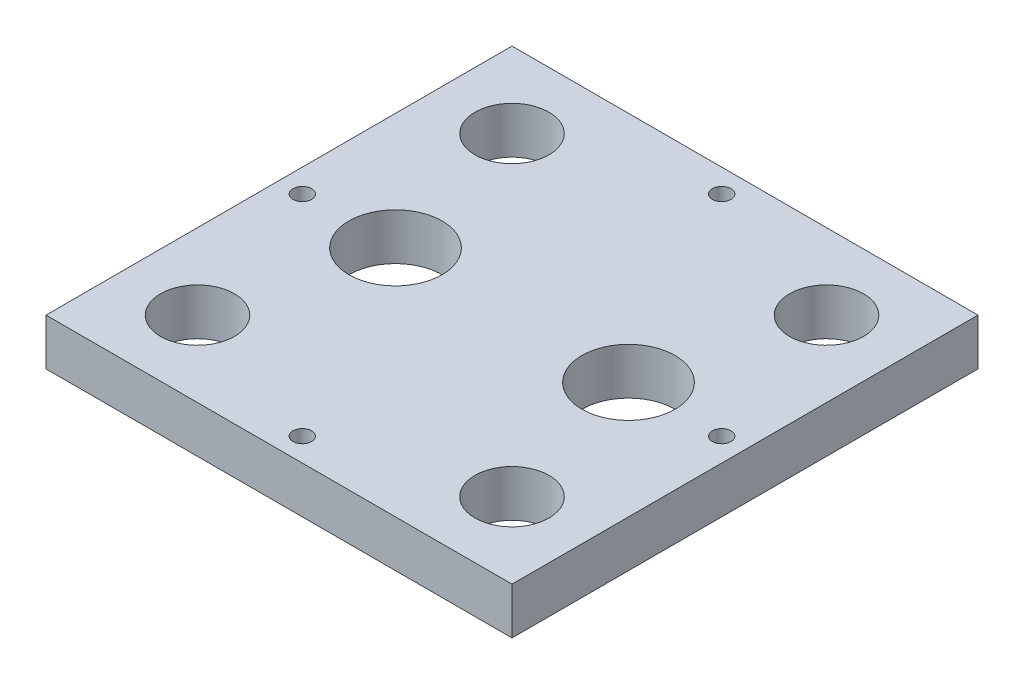
ISO-10303-21;
HEADER;
FILE_DESCRIPTION(('STEP AP214'),'2;1');
FILE_NAME('part.step','',(''),(''),'','','');
FILE_SCHEMA(('AUTOMOTIVE_DESIGN { 1 0 10303 214 1 1 1 1 }'));
ENDSEC;
DATA;
#1=APPLICATION_CONTEXT('core data for automotive mechanical design processes');
#2=APPLICATION_PROTOCOL_DEFINITION('international standard','automotive_design',2000,#1);
#3=PRODUCT_CONTEXT('',#1,'mechanical');
#4=PRODUCT('Part','Part','',(#3));
#5=PRODUCT_RELATED_PRODUCT_CATEGORY('part','',(#4));
#6=PRODUCT_DEFINITION_FORMATION('','',#4);
#7=PRODUCT_DEFINITION_CONTEXT('part definition',#1,'design');
#8=PRODUCT_DEFINITION('design','',#6,#7);
#9=PRODUCT_DEFINITION_SHAPE('','',#8);
#10=(LENGTH_UNIT() NAMED_UNIT(*) SI_UNIT(.MILLI.,.METRE.));
#11=(NAMED_UNIT(*) PLANE_ANGLE_UNIT() SI_UNIT($,.RADIAN.));
#12=(NAMED_UNIT(*) SI_UNIT($,.STERADIAN.) SOLID_ANGLE_UNIT());
#13=UNCERTAINTY_MEASURE_WITH_UNIT(LENGTH_MEASURE(1.E-05),#10,'distance_accuracy_value','');
#14=(GEOMETRIC_REPRESENTATION_CONTEXT(3) GLOBAL_UNCERTAINTY_ASSIGNED_CONTEXT((#13)) GLOBAL_UNIT_ASSIGNED_CONTEXT((#10,
#11,#12)) REPRESENTATION_CONTEXT('',''));
#15=CARTESIAN_POINT('',(0.,0.,0.));
#16=DIRECTION('',(0.,0.,1.));
#17=DIRECTION('',(1.,0.,0.));
#18=AXIS2_PLACEMENT_3D('',#15,#16,#17);
#19=CARTESIAN_POINT('',(0.,200.,0.));
#20=DIRECTION('',(0.,1.,0.));
#21=DIRECTION('',(0.,0.,1.));
#22=AXIS2_PLACEMENT_3D('',#19,#20,#21);
#23=PLANE('',#22);
#24=CARTESIAN_POINT('',(25.,200.,0.));
#25=DIRECTION('',(0.,1.,0.));
#26=DIRECTION('',(0.,0.,1.));
#27=AXIS2_PLACEMENT_3D('',#24,#25,#26);
#28=CIRCLE('',#27,9.99999999999999);
#29=CARTESIAN_POINT('',(25.,200.,9.99999999999999));
#30=VERTEX_POINT('',#29);
#31=EDGE_CURVE('E111',#30,#30,#28,.T.);
#32=ORIENTED_EDGE('',*,*,#31,.F.);
#33=EDGE_LOOP('',(#32));
#34=FACE_BOUND('',#33,.T.);
#35=CARTESIAN_POINT('',(-25.,200.,0.));
#36=DIRECTION('',(0.,1.,0.));
#37=DIRECTION('',(0.,0.,1.));
#38=AXIS2_PLACEMENT_3D('',#35,#36,#37);
#39=CIRCLE('',#38,10.);
#40=CARTESIAN_POINT('',(-25.,200.,10.));
#41=VERTEX_POINT('',#40);
#42=EDGE_CURVE('E117',#41,#41,#39,.T.);
#43=ORIENTED_EDGE('',*,*,#42,.F.);
#44=EDGE_LOOP('',(#43));
#45=FACE_BOUND('',#44,.T.);
#46=CARTESIAN_POINT('',(45.,200.,0.));
#47=DIRECTION('',(0.,1.,0.));
#48=DIRECTION('',(0.,0.,1.));
#49=AXIS2_PLACEMENT_3D('',#46,#47,#48);
#50=CIRCLE('',#49,2.);
#51=CARTESIAN_POINT('',(45.,200.,2.));
#52=VERTEX_POINT('',#51);
#53=EDGE_CURVE('E130',#52,#52,#50,.T.);
#54=ORIENTED_EDGE('',*,*,#53,.F.);
#55=EDGE_LOOP('',(#54));
#56=FACE_BOUND('',#55,.T.);
#57=CARTESIAN_POINT('',(0.,200.,45.));
#58=DIRECTION('',(0.,1.,0.));
#59=DIRECTION('',(0.,0.,1.));
#60=AXIS2_PLACEMENT_3D('',#57,#58,#59);
#61=CIRCLE('',#60,2.);
#62=CARTESIAN_POINT('',(0.,200.,47.));
#63=VERTEX_POINT('',#62);
#64=EDGE_CURVE('E142',#63,#63,#61,.T.);
#65=ORIENTED_EDGE('',*,*,#64,.F.);
#66=EDGE_LOOP('',(#65));
#67=FACE_BOUND('',#66,.T.);
#68=CARTESIAN_POINT('',(-33.7459,200.,-33.7459));
#69=DIRECTION('',(0.,1.,0.));
#70=DIRECTION('',(0.,0.,1.));
#71=AXIS2_PLACEMENT_3D('',#68,#69,#70);
#72=CIRCLE('',#71,7.9375);
#73=CARTESIAN_POINT('',(-33.7459,200.,-25.8084));
#74=VERTEX_POINT('',#73);
#75=EDGE_CURVE('E154',#74,#74,#72,.T.);
#76=ORIENTED_EDGE('',*,*,#75,.F.);
#77=EDGE_LOOP('',(#76));
#78=FACE_BOUND('',#77,.T.);
#79=CARTESIAN_POINT('',(-33.7459,200.,33.7459));
#80=DIRECTION('',(0.,1.,0.));
#81=DIRECTION('',(0.,0.,1.));
#82=AXIS2_PLACEMENT_3D('',#79,#80,#81);
#83=CIRCLE('',#82,7.9375);
#84=CARTESIAN_POINT('',(-33.7459,200.,41.6834));
#85=VERTEX_POINT('',#84);
#86=EDGE_CURVE('E104',#85,#85,#83,.T.);
#87=ORIENTED_EDGE('',*,*,#86,.F.);
#88=EDGE_LOOP('',(#87));
#89=FACE_BOUND('',#88,.T.);
#90=DIRECTION('',(-1.,0.,0.));
#91=VECTOR('',#90,1.);
#92=CARTESIAN_POINT('',(0.,200.,-50.));
#93=LINE('',#92,#91);
#94=CARTESIAN_POINT('',(50.,200.,-50.));
#95=VERTEX_POINT('',#94);
#96=CARTESIAN_POINT('',(-50.,200.,-50.));
#97=VERTEX_POINT('',#96);
#98=EDGE_CURVE('E88',#95,#97,#93,.T.);
#99=ORIENTED_EDGE('',*,*,#98,.T.);
#100=DIRECTION('',(0.,0.,1.));
#101=VECTOR('',#100,1.);
#102=CARTESIAN_POINT('',(-50.,200.,0.));
#103=LINE('',#102,#101);
#104=CARTESIAN_POINT('',(-50.,200.,50.));
#105=VERTEX_POINT('',#104);
#106=EDGE_CURVE('E83',#97,#105,#103,.T.);
#107=ORIENTED_EDGE('',*,*,#106,.T.);
#108=DIRECTION('',(1.,0.,0.));
#109=VECTOR('',#108,1.);
#110=CARTESIAN_POINT('',(0.,200.,50.));
#111=LINE('',#110,#109);
#112=CARTESIAN_POINT('',(50.,200.,50.));
#113=VERTEX_POINT('',#112);
#114=EDGE_CURVE('E86',#105,#113,#111,.T.);
#115=ORIENTED_EDGE('',*,*,#114,.T.);
#116=DIRECTION('',(0.,0.,-1.));
#117=VECTOR('',#116,1.);
#118=CARTESIAN_POINT('',(50.,200.,0.));
#119=LINE('',#118,#117);
#120=EDGE_CURVE('E53',#113,#95,#119,.T.);
#121=ORIENTED_EDGE('',*,*,#120,.T.);
#122=EDGE_LOOP('',(#99,#107,#115,#121));
#123=FACE_BOUND('',#122,.T.);
#124=CARTESIAN_POINT('',(33.7459,200.,-33.7459));
#125=DIRECTION('',(0.,1.,0.));
#126=DIRECTION('',(0.,0.,1.));
#127=AXIS2_PLACEMENT_3D('',#124,#125,#126);
#128=CIRCLE('',#127,7.93750000000001);
#129=CARTESIAN_POINT('',(33.7459,200.,-25.8084));
#130=VERTEX_POINT('',#129);
#131=EDGE_CURVE('E160',#130,#130,#128,.T.);
#132=ORIENTED_EDGE('',*,*,#131,.F.);
#133=EDGE_LOOP('',(#132));
#134=FACE_BOUND('',#133,.T.);
#135=CARTESIAN_POINT('',(33.7459,200.,33.7459));
#136=DIRECTION('',(0.,1.,0.));
#137=DIRECTION('',(0.,0.,1.));
#138=AXIS2_PLACEMENT_3D('',#135,#136,#137);
#139=CIRCLE('',#138,7.93750000000001);
#140=CARTESIAN_POINT('',(33.7459,200.,41.6834));
#141=VERTEX_POINT('',#140);
#142=EDGE_CURVE('E148',#141,#141,#139,.T.);
#143=ORIENTED_EDGE('',*,*,#142,.F.);
#144=EDGE_LOOP('',(#143));
#145=FACE_BOUND('',#144,.T.);
#146=CARTESIAN_POINT('',(-45.,200.,0.));
#147=DIRECTION('',(0.,1.,0.));
#148=DIRECTION('',(0.,0.,1.));
#149=AXIS2_PLACEMENT_3D('',#146,#147,#148);
#150=CIRCLE('',#149,2.);
#151=CARTESIAN_POINT('',(-45.,200.,2.00000000000001));
#152=VERTEX_POINT('',#151);
#153=EDGE_CURVE('E136',#152,#152,#150,.T.);
#154=ORIENTED_EDGE('',*,*,#153,.F.);
#155=EDGE_LOOP('',(#154));
#156=FACE_BOUND('',#155,.T.);
#157=CARTESIAN_POINT('',(0.,200.,-45.));
#158=DIRECTION('',(0.,1.,0.));
#159=DIRECTION('',(0.,0.,1.));
#160=AXIS2_PLACEMENT_3D('',#157,#158,#159);
#161=CIRCLE('',#160,2.);
#162=CARTESIAN_POINT('',(0.,200.,-43.));
#163=VERTEX_POINT('',#162);
#164=EDGE_CURVE('E124',#163,#163,#161,.T.);
#165=ORIENTED_EDGE('',*,*,#164,.F.);
#166=EDGE_LOOP('',(#165));
#167=FACE_BOUND('',#166,.T.);
#168=ADVANCED_FACE('F34',(#34,#45,#56,#67,#78,#89,#123,#134,#145,#156,#167),#23,.T.);
#169=CARTESIAN_POINT('',(0.,190.,0.));
#170=DIRECTION('',(0.,1.,0.));
#171=DIRECTION('',(0.,0.,1.));
#172=AXIS2_PLACEMENT_3D('',#169,#170,#171);
#173=PLANE('',#172);
#174=CARTESIAN_POINT('',(25.,190.,0.));
#175=DIRECTION('',(0.,1.,0.));
#176=DIRECTION('',(0.,0.,1.));
#177=AXIS2_PLACEMENT_3D('',#174,#175,#176);
#178=CIRCLE('',#177,9.99999999999999);
#179=CARTESIAN_POINT('',(25.,190.,9.99999999999999));
#180=VERTEX_POINT('',#179);
#181=EDGE_CURVE('E38',#180,#180,#178,.T.);
#182=ORIENTED_EDGE('',*,*,#181,.T.);
#183=EDGE_LOOP('',(#182));
#184=FACE_BOUND('',#183,.T.);
#185=CARTESIAN_POINT('',(-25.,190.,0.));
#186=DIRECTION('',(0.,1.,0.));
#187=DIRECTION('',(0.,0.,1.));
#188=AXIS2_PLACEMENT_3D('',#185,#186,#187);
#189=CIRCLE('',#188,10.);
#190=CARTESIAN_POINT('',(-25.,190.,10.));
#191=VERTEX_POINT('',#190);
#192=EDGE_CURVE('E109',#191,#191,#189,.T.);
#193=ORIENTED_EDGE('',*,*,#192,.T.);
#194=EDGE_LOOP('',(#193));
#195=FACE_BOUND('',#194,.T.);
#196=DIRECTION('',(-1.,0.,0.));
#197=VECTOR('',#196,1.);
#198=CARTESIAN_POINT('',(0.,190.,-50.));
#199=LINE('',#198,#197);
#200=CARTESIAN_POINT('',(50.,190.,-50.));
#201=VERTEX_POINT('',#200);
#202=CARTESIAN_POINT('',(-50.,190.,-50.));
#203=VERTEX_POINT('',#202);
#204=EDGE_CURVE('E101',#201,#203,#199,.T.);
#205=ORIENTED_EDGE('',*,*,#204,.F.);
#206=DIRECTION('',(0.,0.,-1.));
#207=VECTOR('',#206,1.);
#208=CARTESIAN_POINT('',(50.,190.,0.));
#209=LINE('',#208,#207);
#210=CARTESIAN_POINT('',(50.,190.,50.));
#211=VERTEX_POINT('',#210);
#212=EDGE_CURVE('E76',#211,#201,#209,.T.);
#213=ORIENTED_EDGE('',*,*,#212,.F.);
#214=DIRECTION('',(1.,0.,0.));
#215=VECTOR('',#214,1.);
#216=CARTESIAN_POINT('',(0.,190.,50.));
#217=LINE('',#216,#215);
#218=CARTESIAN_POINT('',(-50.,190.,50.));
#219=VERTEX_POINT('',#218);
#220=EDGE_CURVE('E70',#219,#211,#217,.T.);
#221=ORIENTED_EDGE('',*,*,#220,.F.);
#222=DIRECTION('',(0.,0.,1.));
#223=VECTOR('',#222,1.);
#224=CARTESIAN_POINT('',(-50.,190.,0.));
#225=LINE('',#224,#223);
#226=EDGE_CURVE('E92',#203,#219,#225,.T.);
#227=ORIENTED_EDGE('',*,*,#226,.F.);
#228=EDGE_LOOP('',(#205,#213,#221,#227));
#229=FACE_BOUND('',#228,.T.);
#230=CARTESIAN_POINT('',(-33.7459,190.,33.7459));
#231=DIRECTION('',(0.,1.,0.));
#232=DIRECTION('',(0.,0.,1.));
#233=AXIS2_PLACEMENT_3D('',#230,#231,#232);
#234=CIRCLE('',#233,7.9375);
#235=CARTESIAN_POINT('',(-33.7459,190.,41.6834));
#236=VERTEX_POINT('',#235);
#237=EDGE_CURVE('E163',#236,#236,#234,.T.);
#238=ORIENTED_EDGE('',*,*,#237,.T.);
#239=EDGE_LOOP('',(#238));
#240=FACE_BOUND('',#239,.T.);
#241=CARTESIAN_POINT('',(33.7459,190.,-33.7459));
#242=DIRECTION('',(0.,1.,0.));
#243=DIRECTION('',(0.,0.,1.));
#244=AXIS2_PLACEMENT_3D('',#241,#242,#243);
#245=CIRCLE('',#244,7.93750000000001);
#246=CARTESIAN_POINT('',(33.7459,190.,-25.8084));
#247=VERTEX_POINT('',#246);
#248=EDGE_CURVE('E157',#247,#247,#245,.T.);
#249=ORIENTED_EDGE('',*,*,#248,.T.);
#250=EDGE_LOOP('',(#249));
#251=FACE_BOUND('',#250,.T.);
#252=CARTESIAN_POINT('',(-33.7459,190.,-33.7459));
#253=DIRECTION('',(0.,1.,0.));
#254=DIRECTION('',(0.,0.,1.));
#255=AXIS2_PLACEMENT_3D('',#252,#253,#254);
#256=CIRCLE('',#255,7.9375);
#257=CARTESIAN_POINT('',(-33.7459,190.,-25.8084));
#258=VERTEX_POINT('',#257);
#259=EDGE_CURVE('E151',#258,#258,#256,.T.);
#260=ORIENTED_EDGE('',*,*,#259,.T.);
#261=EDGE_LOOP('',(#260));
#262=FACE_BOUND('',#261,.T.);
#263=CARTESIAN_POINT('',(33.7459,190.,33.7459));
#264=DIRECTION('',(0.,1.,0.));
#265=DIRECTION('',(0.,0.,1.));
#266=AXIS2_PLACEMENT_3D('',#263,#264,#265);
#267=CIRCLE('',#266,7.93750000000001);
#268=CARTESIAN_POINT('',(33.7459,190.,41.6834));
#269=VERTEX_POINT('',#268);
#270=EDGE_CURVE('E145',#269,#269,#267,.T.);
#271=ORIENTED_EDGE('',*,*,#270,.T.);
#272=EDGE_LOOP('',(#271));
#273=FACE_BOUND('',#272,.T.);
#274=CARTESIAN_POINT('',(0.,190.,45.));
#275=DIRECTION('',(0.,1.,0.));
#276=DIRECTION('',(0.,0.,1.));
#277=AXIS2_PLACEMENT_3D('',#274,#275,#276);
#278=CIRCLE('',#277,2.);
#279=CARTESIAN_POINT('',(0.,190.,47.));
#280=VERTEX_POINT('',#279);
#281=EDGE_CURVE('E139',#280,#280,#278,.T.);
#282=ORIENTED_EDGE('',*,*,#281,.T.);
#283=EDGE_LOOP('',(#282));
#284=FACE_BOUND('',#283,.T.);
#285=CARTESIAN_POINT('',(-45.,190.,0.));
#286=DIRECTION('',(0.,1.,0.));
#287=DIRECTION('',(0.,0.,1.));
#288=AXIS2_PLACEMENT_3D('',#285,#286,#287);
#289=CIRCLE('',#288,2.);
#290=CARTESIAN_POINT('',(-45.,190.,2.00000000000001));
#291=VERTEX_POINT('',#290);
#292=EDGE_CURVE('E133',#291,#291,#289,.T.);
#293=ORIENTED_EDGE('',*,*,#292,.T.);
#294=EDGE_LOOP('',(#293));
#295=FACE_BOUND('',#294,.T.);
#296=CARTESIAN_POINT('',(45.,190.,0.));
#297=DIRECTION('',(0.,1.,0.));
#298=DIRECTION('',(0.,0.,1.));
#299=AXIS2_PLACEMENT_3D('',#296,#297,#298);
#300=CIRCLE('',#299,2.);
#301=CARTESIAN_POINT('',(45.,190.,2.));
#302=VERTEX_POINT('',#301);
#303=EDGE_CURVE('E127',#302,#302,#300,.T.);
#304=ORIENTED_EDGE('',*,*,#303,.T.);
#305=EDGE_LOOP('',(#304));
#306=FACE_BOUND('',#305,.T.);
#307=CARTESIAN_POINT('',(0.,190.,-45.));
#308=DIRECTION('',(0.,1.,0.));
#309=DIRECTION('',(0.,0.,1.));
#310=AXIS2_PLACEMENT_3D('',#307,#308,#309);
#311=CIRCLE('',#310,2.);
#312=CARTESIAN_POINT('',(0.,190.,-43.));
#313=VERTEX_POINT('',#312);
#314=EDGE_CURVE('E115',#313,#313,#311,.T.);
#315=ORIENTED_EDGE('',*,*,#314,.T.);
#316=EDGE_LOOP('',(#315));
#317=FACE_BOUND('',#316,.T.);
#318=ADVANCED_FACE('F171',(#184,#195,#229,#240,#251,#262,#273,#284,#295,#306,#317),#173,.F.);
#319=CARTESIAN_POINT('',(0.,200.,-50.));
#320=DIRECTION('',(0.,0.,1.));
#321=DIRECTION('',(1.,0.,0.));
#322=AXIS2_PLACEMENT_3D('',#319,#320,#321);
#323=PLANE('',#322);
#324=ORIENTED_EDGE('',*,*,#204,.T.);
#325=DIRECTION('',(0.,-1.,0.));
#326=VECTOR('',#325,1.);
#327=CARTESIAN_POINT('',(-50.,200.,-50.));
#328=LINE('',#327,#326);
#329=EDGE_CURVE('E11',#97,#203,#328,.T.);
#330=ORIENTED_EDGE('',*,*,#329,.F.);
#331=ORIENTED_EDGE('',*,*,#98,.F.);
#332=DIRECTION('',(0.,-1.,0.));
#333=VECTOR('',#332,1.);
#334=CARTESIAN_POINT('',(50.,200.,-50.));
#335=LINE('',#334,#333);
#336=EDGE_CURVE('E97',#95,#201,#335,.T.);
#337=ORIENTED_EDGE('',*,*,#336,.T.);
#338=EDGE_LOOP('',(#324,#330,#331,#337));
#339=FACE_BOUND('',#338,.T.);
#340=ADVANCED_FACE('F36',(#339),#323,.F.);
#341=CARTESIAN_POINT('',(-50.,200.,0.));
#342=DIRECTION('',(1.,0.,0.));
#343=DIRECTION('',(0.,0.,-1.));
#344=AXIS2_PLACEMENT_3D('',#341,#342,#343);
#345=PLANE('',#344);
#346=ORIENTED_EDGE('',*,*,#226,.T.);
#347=DIRECTION('',(0.,-1.,0.));
#348=VECTOR('',#347,1.);
#349=CARTESIAN_POINT('',(-50.,200.,50.));
#350=LINE('',#349,#348);
#351=EDGE_CURVE('E44',#105,#219,#350,.T.);
#352=ORIENTED_EDGE('',*,*,#351,.F.);
#353=ORIENTED_EDGE('',*,*,#106,.F.);
#354=ORIENTED_EDGE('',*,*,#329,.T.);
#355=EDGE_LOOP('',(#346,#352,#353,#354));
#356=FACE_BOUND('',#355,.T.);
#357=ADVANCED_FACE('F91',(#356),#345,.F.);
#358=CARTESIAN_POINT('',(0.,200.,50.));
#359=DIRECTION('',(0.,0.,-1.));
#360=DIRECTION('',(-1.,0.,0.));
#361=AXIS2_PLACEMENT_3D('',#358,#359,#360);
#362=PLANE('',#361);
#363=ORIENTED_EDGE('',*,*,#220,.T.);
#364=DIRECTION('',(0.,-1.,0.));
#365=VECTOR('',#364,1.);
#366=CARTESIAN_POINT('',(50.,200.,50.));
#367=LINE('',#366,#365);
#368=EDGE_CURVE('E93',#113,#211,#367,.T.);
#369=ORIENTED_EDGE('',*,*,#368,.F.);
#370=ORIENTED_EDGE('',*,*,#114,.F.);
#371=ORIENTED_EDGE('',*,*,#351,.T.);
#372=EDGE_LOOP('',(#363,#369,#370,#371));
#373=FACE_BOUND('',#372,.T.);
#374=ADVANCED_FACE('F95',(#373),#362,.F.);
#375=CARTESIAN_POINT('',(50.,200.,0.));
#376=DIRECTION('',(-1.,0.,0.));
#377=DIRECTION('',(0.,0.,1.));
#378=AXIS2_PLACEMENT_3D('',#375,#376,#377);
#379=PLANE('',#378);
#380=ORIENTED_EDGE('',*,*,#212,.T.);
#381=ORIENTED_EDGE('',*,*,#336,.F.);
#382=ORIENTED_EDGE('',*,*,#120,.F.);
#383=ORIENTED_EDGE('',*,*,#368,.T.);
#384=EDGE_LOOP('',(#380,#381,#382,#383));
#385=FACE_BOUND('',#384,.T.);
#386=ADVANCED_FACE('F177',(#385),#379,.F.);
#387=CARTESIAN_POINT('',(-33.7459,200.,33.7459));
#388=DIRECTION('',(0.,-1.,0.));
#389=DIRECTION('',(0.,0.,-1.));
#390=AXIS2_PLACEMENT_3D('',#387,#388,#389);
#391=CYLINDRICAL_SURFACE('',#390,7.9375);
#392=ORIENTED_EDGE('',*,*,#86,.T.);
#393=EDGE_LOOP('',(#392));
#394=FACE_BOUND('',#393,.T.);
#395=ORIENTED_EDGE('',*,*,#237,.F.);
#396=EDGE_LOOP('',(#395));
#397=FACE_BOUND('',#396,.T.);
#398=ADVANCED_FACE('F174',(#394,#397),#391,.F.);
#399=CARTESIAN_POINT('',(33.7459,200.,-33.7459));
#400=DIRECTION('',(0.,-1.,0.));
#401=DIRECTION('',(0.,0.,-1.));
#402=AXIS2_PLACEMENT_3D('',#399,#400,#401);
#403=CYLINDRICAL_SURFACE('',#402,7.93750000000001);
#404=ORIENTED_EDGE('',*,*,#131,.T.);
#405=EDGE_LOOP('',(#404));
#406=FACE_BOUND('',#405,.T.);
#407=ORIENTED_EDGE('',*,*,#248,.F.);
#408=EDGE_LOOP('',(#407));
#409=FACE_BOUND('',#408,.T.);
#410=ADVANCED_FACE('F176',(#406,#409),#403,.F.);
#411=CARTESIAN_POINT('',(-33.7459,200.,-33.7459));
#412=DIRECTION('',(0.,-1.,0.));
#413=DIRECTION('',(0.,0.,-1.));
#414=AXIS2_PLACEMENT_3D('',#411,#412,#413);
#415=CYLINDRICAL_SURFACE('',#414,7.9375);
#416=ORIENTED_EDGE('',*,*,#75,.T.);
#417=EDGE_LOOP('',(#416));
#418=FACE_BOUND('',#417,.T.);
#419=ORIENTED_EDGE('',*,*,#259,.F.);
#420=EDGE_LOOP('',(#419));
#421=FACE_BOUND('',#420,.T.);
#422=ADVANCED_FACE('F184',(#418,#421),#415,.F.);
#423=CARTESIAN_POINT('',(33.7459,200.,33.7459));
#424=DIRECTION('',(0.,-1.,0.));
#425=DIRECTION('',(0.,0.,-1.));
#426=AXIS2_PLACEMENT_3D('',#423,#424,#425);
#427=CYLINDRICAL_SURFACE('',#426,7.93750000000001);
#428=ORIENTED_EDGE('',*,*,#142,.T.);
#429=EDGE_LOOP('',(#428));
#430=FACE_BOUND('',#429,.T.);
#431=ORIENTED_EDGE('',*,*,#270,.F.);
#432=EDGE_LOOP('',(#431));
#433=FACE_BOUND('',#432,.T.);
#434=ADVANCED_FACE('F237',(#430,#433),#427,.F.);
#435=CARTESIAN_POINT('',(0.,200.,45.));
#436=DIRECTION('',(0.,-1.,0.));
#437=DIRECTION('',(0.,0.,-1.));
#438=AXIS2_PLACEMENT_3D('',#435,#436,#437);
#439=CYLINDRICAL_SURFACE('',#438,2.);
#440=ORIENTED_EDGE('',*,*,#64,.T.);
#441=EDGE_LOOP('',(#440));
#442=FACE_BOUND('',#441,.T.);
#443=ORIENTED_EDGE('',*,*,#281,.F.);
#444=EDGE_LOOP('',(#443));
#445=FACE_BOUND('',#444,.T.);
#446=ADVANCED_FACE('F246',(#442,#445),#439,.F.);
#447=CARTESIAN_POINT('',(-45.,200.,0.));
#448=DIRECTION('',(0.,-1.,0.));
#449=DIRECTION('',(0.,0.,-1.));
#450=AXIS2_PLACEMENT_3D('',#447,#448,#449);
#451=CYLINDRICAL_SURFACE('',#450,2.);
#452=ORIENTED_EDGE('',*,*,#153,.T.);
#453=EDGE_LOOP('',(#452));
#454=FACE_BOUND('',#453,.T.);
#455=ORIENTED_EDGE('',*,*,#292,.F.);
#456=EDGE_LOOP('',(#455));
#457=FACE_BOUND('',#456,.T.);
#458=ADVANCED_FACE('F255',(#454,#457),#451,.F.);
#459=CARTESIAN_POINT('',(45.,200.,0.));
#460=DIRECTION('',(0.,-1.,0.));
#461=DIRECTION('',(0.,0.,-1.));
#462=AXIS2_PLACEMENT_3D('',#459,#460,#461);
#463=CYLINDRICAL_SURFACE('',#462,2.);
#464=ORIENTED_EDGE('',*,*,#53,.T.);
#465=EDGE_LOOP('',(#464));
#466=FACE_BOUND('',#465,.T.);
#467=ORIENTED_EDGE('',*,*,#303,.F.);
#468=EDGE_LOOP('',(#467));
#469=FACE_BOUND('',#468,.T.);
#470=ADVANCED_FACE('F264',(#466,#469),#463,.F.);
#471=CARTESIAN_POINT('',(0.,200.,-45.));
#472=DIRECTION('',(0.,-1.,0.));
#473=DIRECTION('',(0.,0.,-1.));
#474=AXIS2_PLACEMENT_3D('',#471,#472,#473);
#475=CYLINDRICAL_SURFACE('',#474,2.);
#476=ORIENTED_EDGE('',*,*,#164,.T.);
#477=EDGE_LOOP('',(#476));
#478=FACE_BOUND('',#477,.T.);
#479=ORIENTED_EDGE('',*,*,#314,.F.);
#480=EDGE_LOOP('',(#479));
#481=FACE_BOUND('',#480,.T.);
#482=ADVANCED_FACE('F273',(#478,#481),#475,.F.);
#483=CARTESIAN_POINT('',(-25.,-1.2E-05,0.));
#484=DIRECTION('',(0.,1.,0.));
#485=DIRECTION('',(0.,0.,1.));
#486=AXIS2_PLACEMENT_3D('',#483,#484,#485);
#487=CYLINDRICAL_SURFACE('',#486,10.);
#488=CARTESIAN_POINT('',(-25.,200.,10.));
#489=CARTESIAN_POINT('',(-25.,199.895833333333,10.));
#490=CARTESIAN_POINT('',(-25.,199.791666666667,10.));
#491=CARTESIAN_POINT('',(-25.,199.583333333333,10.));
#492=CARTESIAN_POINT('',(-25.,199.479166666667,10.));
#493=CARTESIAN_POINT('',(-25.,199.270833333333,10.));
#494=CARTESIAN_POINT('',(-25.,199.166666666667,10.));
#495=CARTESIAN_POINT('',(-25.,198.958333333333,10.));
#496=CARTESIAN_POINT('',(-25.,198.854166666667,10.));
#497=CARTESIAN_POINT('',(-25.,198.645833333333,10.));
#498=CARTESIAN_POINT('',(-25.,198.541666666667,10.));
#499=CARTESIAN_POINT('',(-25.,198.333333333333,10.));
#500=CARTESIAN_POINT('',(-25.,198.229166666667,10.));
#501=CARTESIAN_POINT('',(-25.,198.020833333333,10.));
#502=CARTESIAN_POINT('',(-25.,197.916666666667,10.));
#503=CARTESIAN_POINT('',(-25.,197.708333333333,10.));
#504=CARTESIAN_POINT('',(-25.,197.604166666667,10.));
#505=CARTESIAN_POINT('',(-25.,197.395833333333,10.));
#506=CARTESIAN_POINT('',(-25.,197.291666666667,10.));
#507=CARTESIAN_POINT('',(-25.,197.083333333333,10.));
#508=CARTESIAN_POINT('',(-25.,196.979166666667,10.));
#509=CARTESIAN_POINT('',(-25.,196.770833333333,10.));
#510=CARTESIAN_POINT('',(-25.,196.666666666667,10.));
#511=CARTESIAN_POINT('',(-25.,196.458333333333,10.));
#512=CARTESIAN_POINT('',(-25.,196.354166666667,10.));
#513=CARTESIAN_POINT('',(-25.,196.145833333333,10.));
#514=CARTESIAN_POINT('',(-25.,196.041666666667,10.));
#515=CARTESIAN_POINT('',(-25.,195.833333333333,10.));
#516=CARTESIAN_POINT('',(-25.,195.729166666667,10.));
#517=CARTESIAN_POINT('',(-25.,195.520833333333,10.));
#518=CARTESIAN_POINT('',(-25.,195.416666666667,10.));
#519=CARTESIAN_POINT('',(-25.,195.208333333333,10.));
#520=CARTESIAN_POINT('',(-25.,195.104166666667,10.));
#521=CARTESIAN_POINT('',(-25.,194.895833333333,10.));
#522=CARTESIAN_POINT('',(-25.,194.791666666667,10.));
#523=CARTESIAN_POINT('',(-25.,194.583333333333,10.));
#524=CARTESIAN_POINT('',(-25.,194.479166666667,10.));
#525=CARTESIAN_POINT('',(-25.,194.270833333333,10.));
#526=CARTESIAN_POINT('',(-25.,194.166666666667,10.));
#527=CARTESIAN_POINT('',(-25.,193.958333333333,10.));
#528=CARTESIAN_POINT('',(-25.,193.854166666667,10.));
#529=CARTESIAN_POINT('',(-25.,193.645833333333,10.));
#530=CARTESIAN_POINT('',(-25.,193.541666666667,10.));
#531=CARTESIAN_POINT('',(-25.,193.333333333333,10.));
#532=CARTESIAN_POINT('',(-25.,193.229166666667,10.));
#533=CARTESIAN_POINT('',(-25.,193.020833333333,10.));
#534=CARTESIAN_POINT('',(-25.,192.916666666667,10.));
#535=CARTESIAN_POINT('',(-25.,192.708333333333,10.));
#536=CARTESIAN_POINT('',(-25.,192.604166666667,10.));
#537=CARTESIAN_POINT('',(-25.,192.395833333333,10.));
#538=CARTESIAN_POINT('',(-25.,192.291666666667,10.));
#539=CARTESIAN_POINT('',(-25.,192.083333333333,10.));
#540=CARTESIAN_POINT('',(-25.,191.979166666667,10.));
#541=CARTESIAN_POINT('',(-25.,191.770833333333,10.));
#542=CARTESIAN_POINT('',(-25.,191.666666666667,10.));
#543=CARTESIAN_POINT('',(-25.,191.458333333333,10.));
#544=CARTESIAN_POINT('',(-25.,191.354166666667,10.));
#545=CARTESIAN_POINT('',(-25.,191.145833333333,10.));
#546=CARTESIAN_POINT('',(-25.,191.041666666667,10.));
#547=CARTESIAN_POINT('',(-25.,190.833333333333,10.));
#548=CARTESIAN_POINT('',(-25.,190.729166666667,10.));
#549=CARTESIAN_POINT('',(-25.,190.520833333333,10.));
#550=CARTESIAN_POINT('',(-25.,190.416666666667,10.));
#551=CARTESIAN_POINT('',(-25.,190.208333333333,10.));
#552=CARTESIAN_POINT('',(-25.,190.104166666667,10.));
#553=CARTESIAN_POINT('',(-25.,190.,10.));
#554=B_SPLINE_CURVE_WITH_KNOTS('',3,(#488,#489,#490,#491,#492,#493,#494,#495,#496,#497,#498,
#499,#500,#501,#502,#503,#504,#505,#506,#507,#508,#509,#510,#511,#512,#513,#514,#515,#516,#517,
#518,#519,#520,#521,#522,#523,#524,#525,#526,#527,#528,#529,#530,#531,#532,#533,#534,#535,#536,
#537,#538,#539,#540,#541,#542,#543,#544,#545,#546,#547,#548,#549,#550,#551,#552,#553),
.UNSPECIFIED.,.F.,.F.,(4,2,2,2,2,2,2,2,2,2,2,2,2,2,2,2,2,2,2,2,2,2,2,2,2,2,2,2,2,2,2,2,4),(0.,
0.312499999999993,0.624999999999987,0.937500000000008,1.25,1.56249999999999,1.87500000000002,
2.18750000000001,2.5,2.8125,3.12499999999999,3.43750000000001,3.75,4.0625,4.37500000000002,
4.68750000000001,5.,5.3125,5.62499999999999,5.93750000000001,6.25000000000001,6.5625,
6.87500000000002,7.18750000000001,7.50000000000001,7.8125,8.12499999999999,8.43750000000001,
8.75000000000001,9.0625,9.37500000000002,9.68750000000002,10.),.UNSPECIFIED.);
#555=EDGE_CURVE('BSEAM282',#41,#191,#554,.T.);
#556=ORIENTED_EDGE('',*,*,#42,.T.);
#557=ORIENTED_EDGE('',*,*,#192,.F.);
#558=ORIENTED_EDGE('',*,*,#555,.T.);
#559=ORIENTED_EDGE('',*,*,#555,.F.);
#560=EDGE_LOOP('',(#556,#558,#557,#559));
#561=FACE_BOUND('',#560,.T.);
#562=ADVANCED_FACE('F282',(#561),#487,.F.);
#563=CARTESIAN_POINT('',(25.,-1.2E-05,0.));
#564=DIRECTION('',(0.,1.,0.));
#565=DIRECTION('',(0.,0.,1.));
#566=AXIS2_PLACEMENT_3D('',#563,#564,#565);
#567=CYLINDRICAL_SURFACE('',#566,9.99999999999999);
#568=CARTESIAN_POINT('',(25.,200.,9.99999999999999));
#569=CARTESIAN_POINT('',(25.,199.895833333333,9.99999999999999));
#570=CARTESIAN_POINT('',(25.,199.791666666667,9.99999999999999));
#571=CARTESIAN_POINT('',(25.,199.583333333333,9.99999999999999));
#572=CARTESIAN_POINT('',(25.,199.479166666667,9.99999999999999));
#573=CARTESIAN_POINT('',(25.,199.270833333333,9.99999999999999));
#574=CARTESIAN_POINT('',(25.,199.166666666667,9.99999999999999));
#575=CARTESIAN_POINT('',(25.,198.958333333333,9.99999999999999));
#576=CARTESIAN_POINT('',(25.,198.854166666667,9.99999999999999));
#577=CARTESIAN_POINT('',(25.,198.645833333333,9.99999999999999));
#578=CARTESIAN_POINT('',(25.,198.541666666667,9.99999999999999));
#579=CARTESIAN_POINT('',(25.,198.333333333333,9.99999999999999));
#580=CARTESIAN_POINT('',(25.,198.229166666667,9.99999999999999));
#581=CARTESIAN_POINT('',(25.,198.020833333333,9.99999999999999));
#582=CARTESIAN_POINT('',(25.,197.916666666667,9.99999999999999));
#583=CARTESIAN_POINT('',(25.,197.708333333333,9.99999999999999));
#584=CARTESIAN_POINT('',(25.,197.604166666667,9.99999999999999));
#585=CARTESIAN_POINT('',(25.,197.395833333333,9.99999999999999));
#586=CARTESIAN_POINT('',(25.,197.291666666667,9.99999999999999));
#587=CARTESIAN_POINT('',(25.,197.083333333333,9.99999999999999));
#588=CARTESIAN_POINT('',(25.,196.979166666667,9.99999999999999));
#589=CARTESIAN_POINT('',(25.,196.770833333333,9.99999999999999));
#590=CARTESIAN_POINT('',(25.,196.666666666667,9.99999999999999));
#591=CARTESIAN_POINT('',(25.,196.458333333333,9.99999999999999));
#592=CARTESIAN_POINT('',(25.,196.354166666667,9.99999999999999));
#593=CARTESIAN_POINT('',(25.,196.145833333333,9.99999999999999));
#594=CARTESIAN_POINT('',(25.,196.041666666667,9.99999999999999));
#595=CARTESIAN_POINT('',(25.,195.833333333333,9.99999999999999));
#596=CARTESIAN_POINT('',(25.,195.729166666667,9.99999999999999));
#597=CARTESIAN_POINT('',(25.,195.520833333333,9.99999999999999));
#598=CARTESIAN_POINT('',(25.,195.416666666667,9.99999999999999));
#599=CARTESIAN_POINT('',(25.,195.208333333333,9.99999999999999));
#600=CARTESIAN_POINT('',(25.,195.104166666667,9.99999999999999));
#601=CARTESIAN_POINT('',(25.,194.895833333333,9.99999999999999));
#602=CARTESIAN_POINT('',(25.,194.791666666667,9.99999999999999));
#603=CARTESIAN_POINT('',(25.,194.583333333333,9.99999999999999));
#604=CARTESIAN_POINT('',(25.,194.479166666667,9.99999999999999));
#605=CARTESIAN_POINT('',(25.,194.270833333333,9.99999999999999));
#606=CARTESIAN_POINT('',(25.,194.166666666667,9.99999999999999));
#607=CARTESIAN_POINT('',(25.,193.958333333333,9.99999999999999));
#608=CARTESIAN_POINT('',(25.,193.854166666667,9.99999999999999));
#609=CARTESIAN_POINT('',(25.,193.645833333333,9.99999999999999));
#610=CARTESIAN_POINT('',(25.,193.541666666667,9.99999999999999));
#611=CARTESIAN_POINT('',(25.,193.333333333333,9.99999999999999));
#612=CARTESIAN_POINT('',(25.,193.229166666667,9.99999999999999));
#613=CARTESIAN_POINT('',(25.,193.020833333333,9.99999999999999));
#614=CARTESIAN_POINT('',(25.,192.916666666667,9.99999999999999));
#615=CARTESIAN_POINT('',(25.,192.708333333333,9.99999999999999));
#616=CARTESIAN_POINT('',(25.,192.604166666667,9.99999999999999));
#617=CARTESIAN_POINT('',(25.,192.395833333333,9.99999999999999));
#618=CARTESIAN_POINT('',(25.,192.291666666667,9.99999999999999));
#619=CARTESIAN_POINT('',(25.,192.083333333333,9.99999999999999));
#620=CARTESIAN_POINT('',(25.,191.979166666667,9.99999999999999));
#621=CARTESIAN_POINT('',(25.,191.770833333333,9.99999999999999));
#622=CARTESIAN_POINT('',(25.,191.666666666667,9.99999999999999));
#623=CARTESIAN_POINT('',(25.,191.458333333333,9.99999999999999));
#624=CARTESIAN_POINT('',(25.,191.354166666667,9.99999999999999));
#625=CARTESIAN_POINT('',(25.,191.145833333333,9.99999999999999));
#626=CARTESIAN_POINT('',(25.,191.041666666667,9.99999999999999));
#627=CARTESIAN_POINT('',(25.,190.833333333333,9.99999999999999));
#628=CARTESIAN_POINT('',(25.,190.729166666667,9.99999999999999));
#629=CARTESIAN_POINT('',(25.,190.520833333333,9.99999999999999));
#630=CARTESIAN_POINT('',(25.,190.416666666667,9.99999999999999));
#631=CARTESIAN_POINT('',(25.,190.208333333333,9.99999999999999));
#632=CARTESIAN_POINT('',(25.,190.104166666667,9.99999999999999));
#633=CARTESIAN_POINT('',(25.,190.,9.99999999999999));
#634=B_SPLINE_CURVE_WITH_KNOTS('',3,(#568,#569,#570,#571,#572,#573,#574,#575,#576,#577,#578,
#579,#580,#581,#582,#583,#584,#585,#586,#587,#588,#589,#590,#591,#592,#593,#594,#595,#596,#597,
#598,#599,#600,#601,#602,#603,#604,#605,#606,#607,#608,#609,#610,#611,#612,#613,#614,#615,#616,
#617,#618,#619,#620,#621,#622,#623,#624,#625,#626,#627,#628,#629,#630,#631,#632,#633),
.UNSPECIFIED.,.F.,.F.,(4,2,2,2,2,2,2,2,2,2,2,2,2,2,2,2,2,2,2,2,2,2,2,2,2,2,2,2,2,2,2,2,4),(0.,
0.312499999999993,0.624999999999987,0.937500000000008,1.25,1.56249999999999,1.87500000000002,
2.18750000000001,2.5,2.8125,3.12499999999999,3.43750000000001,3.75,4.0625,4.37500000000002,
4.68750000000001,5.,5.3125,5.62499999999999,5.93750000000001,6.25000000000001,6.5625,
6.87500000000002,7.18750000000001,7.50000000000001,7.8125,8.12499999999999,8.43750000000001,
8.75000000000001,9.0625,9.37500000000002,9.68750000000002,10.),.UNSPECIFIED.);
#635=EDGE_CURVE('BSEAM291',#30,#180,#634,.T.);
#636=ORIENTED_EDGE('',*,*,#31,.T.);
#637=ORIENTED_EDGE('',*,*,#181,.F.);
#638=ORIENTED_EDGE('',*,*,#635,.T.);
#639=ORIENTED_EDGE('',*,*,#635,.F.);
#640=EDGE_LOOP('',(#636,#638,#637,#639));
#641=FACE_BOUND('',#640,.T.);
#642=ADVANCED_FACE('F291',(#641),#567,.F.);
#643=CLOSED_SHELL('',(#168,#318,#340,#357,#374,#386,#398,#410,#422,#434,#446,#458,#470,#482,
#562,#642));
#644=MANIFOLD_SOLID_BREP('B2',#643);
#645=ADVANCED_BREP_SHAPE_REPRESENTATION('',(#18,#644),#14);
#646=SHAPE_DEFINITION_REPRESENTATION(#9,#645);
ENDSEC;
END-ISO-10303-21;
